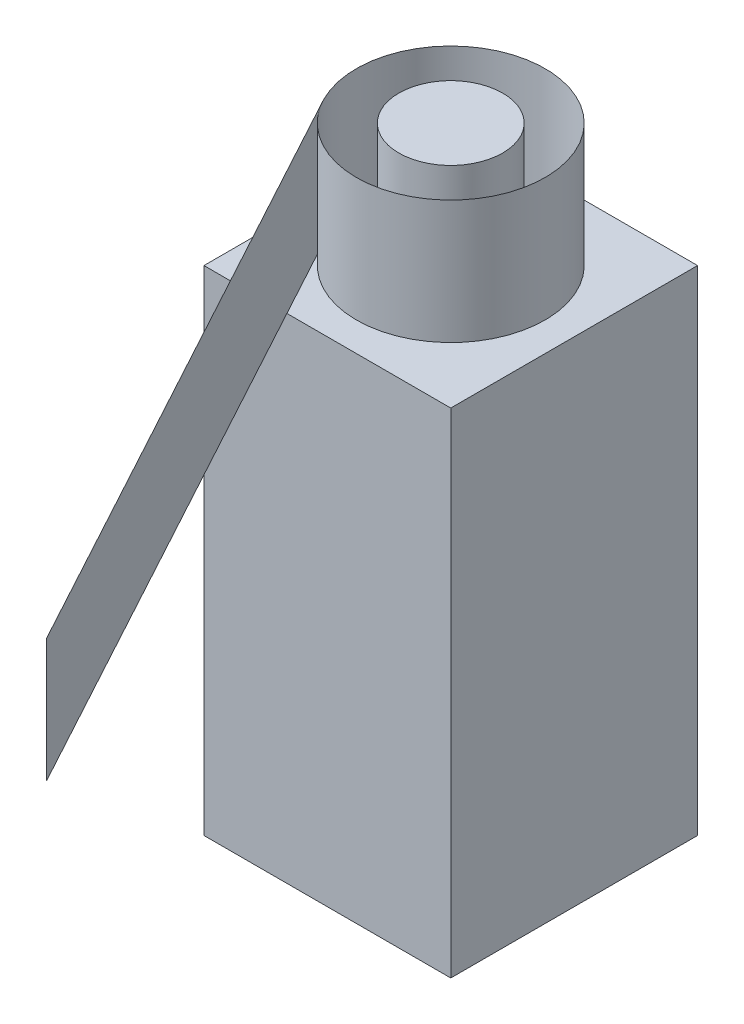
ISO-10303-21;
HEADER;
FILE_DESCRIPTION(('STEP AP214'),'2;1');
FILE_NAME('part.step','',(''),(''),'','','');
FILE_SCHEMA(('AUTOMOTIVE_DESIGN { 1 0 10303 214 1 1 1 1 }'));
ENDSEC;
DATA;
#1=APPLICATION_CONTEXT('core data for automotive mechanical design processes');
#2=APPLICATION_PROTOCOL_DEFINITION('international standard','automotive_design',2000,#1);
#3=PRODUCT_CONTEXT('',#1,'mechanical');
#4=PRODUCT('Part','Part','',(#3));
#5=PRODUCT_RELATED_PRODUCT_CATEGORY('part','',(#4));
#6=PRODUCT_DEFINITION_FORMATION('','',#4);
#7=PRODUCT_DEFINITION_CONTEXT('part definition',#1,'design');
#8=PRODUCT_DEFINITION('design','',#6,#7);
#9=PRODUCT_DEFINITION_SHAPE('','',#8);
#10=(LENGTH_UNIT() NAMED_UNIT(*) SI_UNIT(.MILLI.,.METRE.));
#11=(NAMED_UNIT(*) PLANE_ANGLE_UNIT() SI_UNIT($,.RADIAN.));
#12=(NAMED_UNIT(*) SI_UNIT($,.STERADIAN.) SOLID_ANGLE_UNIT());
#13=UNCERTAINTY_MEASURE_WITH_UNIT(LENGTH_MEASURE(1.E-05),#10,'distance_accuracy_value','');
#14=(GEOMETRIC_REPRESENTATION_CONTEXT(3) GLOBAL_UNCERTAINTY_ASSIGNED_CONTEXT((#13)) GLOBAL_UNIT_ASSIGNED_CONTEXT((#10,
#11,#12)) REPRESENTATION_CONTEXT('',''));
#15=CARTESIAN_POINT('',(0.,0.,0.));
#16=DIRECTION('',(0.,0.,1.));
#17=DIRECTION('',(1.,0.,0.));
#18=AXIS2_PLACEMENT_3D('',#15,#16,#17);
#19=CARTESIAN_POINT('',(-3.36179957917363,20.,1.82252749973264));
#20=DIRECTION('',(-0.879121862749112,0.,0.4765970524841));
#21=DIRECTION('',(0.4765970524841,0.,0.879121862749112));
#22=AXIS2_PLACEMENT_3D('',#19,#20,#21);
#23=PLANE('',#22);
#24=DIRECTION('',(0.4765970524841,0.,0.879121862749112));
#25=VECTOR('',#24,1.);
#26=CARTESIAN_POINT('',(-3.36179957917363,25.,1.82252749973264));
#27=LINE('',#26,#25);
#28=CARTESIAN_POINT('',(-3.36179957917363,25.,1.82252749973264));
#29=VERTEX_POINT('',#28);
#30=CARTESIAN_POINT('',(9.89755493173196,25.,26.2804807659607));
#31=VERTEX_POINT('',#30);
#32=EDGE_CURVE('E63',#29,#31,#27,.T.);
#33=ORIENTED_EDGE('',*,*,#32,.F.);
#34=DIRECTION('',(0.,1.,0.));
#35=VECTOR('',#34,1.);
#36=CARTESIAN_POINT('',(-3.36179957917363,20.,1.82252749973264));
#37=LINE('',#36,#35);
#38=CARTESIAN_POINT('',(-3.36179957917363,20.,1.82252749973264));
#39=VERTEX_POINT('',#38);
#40=EDGE_CURVE('E45',#39,#29,#37,.T.);
#41=ORIENTED_EDGE('',*,*,#40,.F.);
#42=DIRECTION('',(0.4765970524841,0.,0.879121862749112));
#43=VECTOR('',#42,1.);
#44=CARTESIAN_POINT('',(-3.36179957917363,20.,1.82252749973264));
#45=LINE('',#44,#43);
#46=CARTESIAN_POINT('',(9.89755493173196,20.,26.2804807659607));
#47=VERTEX_POINT('',#46);
#48=EDGE_CURVE('E51',#39,#47,#45,.T.);
#49=ORIENTED_EDGE('',*,*,#48,.T.);
#50=DIRECTION('',(0.,1.,0.));
#51=VECTOR('',#50,1.);
#52=CARTESIAN_POINT('',(9.89755493173196,20.,26.2804807659607));
#53=LINE('',#52,#51);
#54=EDGE_CURVE('E12',#47,#31,#53,.T.);
#55=ORIENTED_EDGE('',*,*,#54,.T.);
#56=EDGE_LOOP('',(#33,#41,#49,#55));
#57=FACE_BOUND('',#56,.T.);
#58=ADVANCED_FACE('F44',(#57),#23,.T.);
#59=OPEN_SHELL('',(#58));
#60=SHELL_BASED_SURFACE_MODEL('B2',(#59));
#61=CARTESIAN_POINT('',(0.,20.,0.));
#62=DIRECTION('',(0.,1.,0.));
#63=DIRECTION('',(0.,0.,1.));
#64=AXIS2_PLACEMENT_3D('',#61,#62,#63);
#65=CYLINDRICAL_SURFACE('',#64,3.8240427426761);
#66=CARTESIAN_POINT('',(0.,20.,0.));
#67=DIRECTION('',(0.,1.,0.));
#68=DIRECTION('',(0.,0.,1.));
#69=AXIS2_PLACEMENT_3D('',#66,#67,#68);
#70=CIRCLE('',#69,3.8240427426761);
#71=CARTESIAN_POINT('',(0.,20.,3.8240427426761));
#72=VERTEX_POINT('',#71);
#73=EDGE_CURVE('E101',#72,#72,#70,.T.);
#74=ORIENTED_EDGE('',*,*,#73,.T.);
#75=EDGE_LOOP('',(#74));
#76=FACE_BOUND('',#75,.T.);
#77=CARTESIAN_POINT('',(0.,25.,0.));
#78=DIRECTION('',(0.,1.,0.));
#79=DIRECTION('',(0.,0.,1.));
#80=AXIS2_PLACEMENT_3D('',#77,#78,#79);
#81=CIRCLE('',#80,3.8240427426761);
#82=CARTESIAN_POINT('',(0.,25.,3.8240427426761));
#83=VERTEX_POINT('',#82);
#84=EDGE_CURVE('E43',#83,#83,#81,.T.);
#85=ORIENTED_EDGE('',*,*,#84,.F.);
#86=EDGE_LOOP('',(#85));
#87=FACE_BOUND('',#86,.T.);
#88=ADVANCED_FACE('F97',(#76,#87),#65,.T.);
#89=OPEN_SHELL('',(#88));
#90=SHELL_BASED_SURFACE_MODEL('B6',(#89));
#91=CARTESIAN_POINT('',(-5.,20.,-5.));
#92=DIRECTION('',(1.,0.,0.));
#93=DIRECTION('',(0.,0.,-1.));
#94=AXIS2_PLACEMENT_3D('',#91,#92,#93);
#95=PLANE('',#94);
#96=DIRECTION('',(0.,0.,1.));
#97=VECTOR('',#96,1.);
#98=CARTESIAN_POINT('',(-5.,0.,-5.));
#99=LINE('',#98,#97);
#100=CARTESIAN_POINT('',(-5.,0.,-5.));
#101=VERTEX_POINT('',#100);
#102=CARTESIAN_POINT('',(-5.,0.,5.));
#103=VERTEX_POINT('',#102);
#104=EDGE_CURVE('E188',#101,#103,#99,.T.);
#105=ORIENTED_EDGE('',*,*,#104,.T.);
#106=DIRECTION('',(0.,-1.,0.));
#107=VECTOR('',#106,1.);
#108=CARTESIAN_POINT('',(-5.,20.,5.));
#109=LINE('',#108,#107);
#110=CARTESIAN_POINT('',(-5.,20.,5.));
#111=VERTEX_POINT('',#110);
#112=EDGE_CURVE('E130',#111,#103,#109,.T.);
#113=ORIENTED_EDGE('',*,*,#112,.F.);
#114=DIRECTION('',(0.,0.,1.));
#115=VECTOR('',#114,1.);
#116=CARTESIAN_POINT('',(-5.,20.,-5.));
#117=LINE('',#116,#115);
#118=CARTESIAN_POINT('',(-5.,20.,-5.));
#119=VERTEX_POINT('',#118);
#120=EDGE_CURVE('E174',#119,#111,#117,.T.);
#121=ORIENTED_EDGE('',*,*,#120,.F.);
#122=DIRECTION('',(0.,-1.,0.));
#123=VECTOR('',#122,1.);
#124=CARTESIAN_POINT('',(-5.,20.,-5.));
#125=LINE('',#124,#123);
#126=EDGE_CURVE('E184',#119,#101,#125,.T.);
#127=ORIENTED_EDGE('',*,*,#126,.T.);
#128=EDGE_LOOP('',(#105,#113,#121,#127));
#129=FACE_BOUND('',#128,.T.);
#130=ADVANCED_FACE('F122',(#129),#95,.F.);
#131=CARTESIAN_POINT('',(5.,20.,5.));
#132=DIRECTION('',(0.,0.,-1.));
#133=DIRECTION('',(-1.,0.,0.));
#134=AXIS2_PLACEMENT_3D('',#131,#132,#133);
#135=PLANE('',#134);
#136=DIRECTION('',(1.,0.,0.));
#137=VECTOR('',#136,1.);
#138=CARTESIAN_POINT('',(5.,0.,5.));
#139=LINE('',#138,#137);
#140=CARTESIAN_POINT('',(5.,0.,5.));
#141=VERTEX_POINT('',#140);
#142=EDGE_CURVE('E179',#103,#141,#139,.T.);
#143=ORIENTED_EDGE('',*,*,#142,.T.);
#144=DIRECTION('',(0.,-1.,0.));
#145=VECTOR('',#144,1.);
#146=CARTESIAN_POINT('',(5.,20.,5.));
#147=LINE('',#146,#145);
#148=CARTESIAN_POINT('',(5.,20.,5.));
#149=VERTEX_POINT('',#148);
#150=EDGE_CURVE('E177',#149,#141,#147,.T.);
#151=ORIENTED_EDGE('',*,*,#150,.F.);
#152=DIRECTION('',(1.,0.,0.));
#153=VECTOR('',#152,1.);
#154=CARTESIAN_POINT('',(5.,20.,5.));
#155=LINE('',#154,#153);
#156=EDGE_CURVE('E169',#111,#149,#155,.T.);
#157=ORIENTED_EDGE('',*,*,#156,.F.);
#158=ORIENTED_EDGE('',*,*,#112,.T.);
#159=EDGE_LOOP('',(#143,#151,#157,#158));
#160=FACE_BOUND('',#159,.T.);
#161=ADVANCED_FACE('F178',(#160),#135,.F.);
#162=CARTESIAN_POINT('',(5.,20.,-5.));
#163=DIRECTION('',(-1.,0.,0.));
#164=DIRECTION('',(0.,0.,1.));
#165=AXIS2_PLACEMENT_3D('',#162,#163,#164);
#166=PLANE('',#165);
#167=DIRECTION('',(0.,0.,-1.));
#168=VECTOR('',#167,1.);
#169=CARTESIAN_POINT('',(5.,0.,-5.));
#170=LINE('',#169,#168);
#171=CARTESIAN_POINT('',(5.,0.,-5.));
#172=VERTEX_POINT('',#171);
#173=EDGE_CURVE('E155',#141,#172,#170,.T.);
#174=ORIENTED_EDGE('',*,*,#173,.T.);
#175=DIRECTION('',(0.,-1.,0.));
#176=VECTOR('',#175,1.);
#177=CARTESIAN_POINT('',(5.,20.,-5.));
#178=LINE('',#177,#176);
#179=CARTESIAN_POINT('',(5.,20.,-5.));
#180=VERTEX_POINT('',#179);
#181=EDGE_CURVE('E180',#180,#172,#178,.T.);
#182=ORIENTED_EDGE('',*,*,#181,.F.);
#183=DIRECTION('',(0.,0.,-1.));
#184=VECTOR('',#183,1.);
#185=CARTESIAN_POINT('',(5.,20.,-5.));
#186=LINE('',#185,#184);
#187=EDGE_CURVE('E172',#149,#180,#186,.T.);
#188=ORIENTED_EDGE('',*,*,#187,.F.);
#189=ORIENTED_EDGE('',*,*,#150,.T.);
#190=EDGE_LOOP('',(#174,#182,#188,#189));
#191=FACE_BOUND('',#190,.T.);
#192=ADVANCED_FACE('F182',(#191),#166,.F.);
#193=CARTESIAN_POINT('',(5.,20.,-5.));
#194=DIRECTION('',(0.,0.,1.));
#195=DIRECTION('',(1.,0.,0.));
#196=AXIS2_PLACEMENT_3D('',#193,#194,#195);
#197=PLANE('',#196);
#198=DIRECTION('',(-1.,0.,0.));
#199=VECTOR('',#198,1.);
#200=CARTESIAN_POINT('',(5.,0.,-5.));
#201=LINE('',#200,#199);
#202=EDGE_CURVE('E161',#172,#101,#201,.T.);
#203=ORIENTED_EDGE('',*,*,#202,.T.);
#204=ORIENTED_EDGE('',*,*,#126,.F.);
#205=DIRECTION('',(-1.,0.,0.));
#206=VECTOR('',#205,1.);
#207=CARTESIAN_POINT('',(5.,20.,-5.));
#208=LINE('',#207,#206);
#209=EDGE_CURVE('E138',#180,#119,#208,.T.);
#210=ORIENTED_EDGE('',*,*,#209,.F.);
#211=ORIENTED_EDGE('',*,*,#181,.T.);
#212=EDGE_LOOP('',(#203,#204,#210,#211));
#213=FACE_BOUND('',#212,.T.);
#214=ADVANCED_FACE('F210',(#213),#197,.F.);
#215=CARTESIAN_POINT('',(0.,20.,0.));
#216=DIRECTION('',(0.,-1.,0.));
#217=DIRECTION('',(0.,0.,-1.));
#218=AXIS2_PLACEMENT_3D('',#215,#216,#217);
#219=PLANE('',#218);
#220=CARTESIAN_POINT('',(0.,20.,0.));
#221=DIRECTION('',(0.,-1.,0.));
#222=DIRECTION('',(0.,0.,-1.));
#223=AXIS2_PLACEMENT_3D('',#220,#221,#222);
#224=CIRCLE('',#223,2.10378341396205);
#225=CARTESIAN_POINT('',(0.,20.,-2.10378341396205));
#226=VERTEX_POINT('',#225);
#227=EDGE_CURVE('E95',#226,#226,#224,.F.);
#228=ORIENTED_EDGE('',*,*,#227,.F.);
#229=EDGE_LOOP('',(#228));
#230=FACE_BOUND('',#229,.T.);
#231=ORIENTED_EDGE('',*,*,#120,.T.);
#232=ORIENTED_EDGE('',*,*,#156,.T.);
#233=ORIENTED_EDGE('',*,*,#187,.T.);
#234=ORIENTED_EDGE('',*,*,#209,.T.);
#235=EDGE_LOOP('',(#231,#232,#233,#234));
#236=FACE_BOUND('',#235,.T.);
#237=ADVANCED_FACE('F170',(#230,#236),#219,.F.);
#238=CARTESIAN_POINT('',(0.,0.,0.));
#239=DIRECTION('',(0.,-1.,0.));
#240=DIRECTION('',(0.,0.,-1.));
#241=AXIS2_PLACEMENT_3D('',#238,#239,#240);
#242=PLANE('',#241);
#243=ORIENTED_EDGE('',*,*,#104,.F.);
#244=ORIENTED_EDGE('',*,*,#202,.F.);
#245=ORIENTED_EDGE('',*,*,#173,.F.);
#246=ORIENTED_EDGE('',*,*,#142,.F.);
#247=EDGE_LOOP('',(#243,#244,#245,#246));
#248=FACE_BOUND('',#247,.T.);
#249=ADVANCED_FACE('F199',(#248),#242,.T.);
#250=CARTESIAN_POINT('',(0.,25.,0.));
#251=DIRECTION('',(0.,-1.,0.));
#252=DIRECTION('',(0.,0.,-1.));
#253=AXIS2_PLACEMENT_3D('',#250,#251,#252);
#254=CYLINDRICAL_SURFACE('',#253,2.10378341396205);
#255=CARTESIAN_POINT('',(0.,25.,0.));
#256=DIRECTION('',(0.,1.,0.));
#257=DIRECTION('',(0.,0.,1.));
#258=AXIS2_PLACEMENT_3D('',#255,#256,#257);
#259=CIRCLE('',#258,2.10378341396205);
#260=CARTESIAN_POINT('',(0.,25.,2.10378341396205));
#261=VERTEX_POINT('',#260);
#262=EDGE_CURVE('E191',#261,#261,#259,.T.);
#263=ORIENTED_EDGE('',*,*,#262,.F.);
#264=EDGE_LOOP('',(#263));
#265=FACE_BOUND('',#264,.T.);
#266=ORIENTED_EDGE('',*,*,#227,.T.);
#267=EDGE_LOOP('',(#266));
#268=FACE_BOUND('',#267,.T.);
#269=ADVANCED_FACE('F201',(#265,#268),#254,.T.);
#270=CARTESIAN_POINT('',(0.,25.,0.));
#271=DIRECTION('',(0.,1.,0.));
#272=DIRECTION('',(0.,0.,1.));
#273=AXIS2_PLACEMENT_3D('',#270,#271,#272);
#274=PLANE('',#273);
#275=ORIENTED_EDGE('',*,*,#262,.T.);
#276=EDGE_LOOP('',(#275));
#277=FACE_BOUND('',#276,.T.);
#278=ADVANCED_FACE('F207',(#277),#274,.T.);
#279=CLOSED_SHELL('',(#130,#161,#192,#214,#237,#249,#269,#278));
#280=MANIFOLD_SOLID_BREP('B38',#279);
#281=ADVANCED_BREP_SHAPE_REPRESENTATION('',(#18,#280),#14);
#282=MANIFOLD_SURFACE_SHAPE_REPRESENTATION('',(#18,#60,#90),#14);
#283=SHAPE_REPRESENTATION('',(#18),#14);
#284=SHAPE_DEFINITION_REPRESENTATION(#9,#283);
#285=SHAPE_REPRESENTATION_RELATIONSHIP('','',#283,#281);
#286=SHAPE_REPRESENTATION_RELATIONSHIP('','',#283,#282);
ENDSEC;
END-ISO-10303-21;
